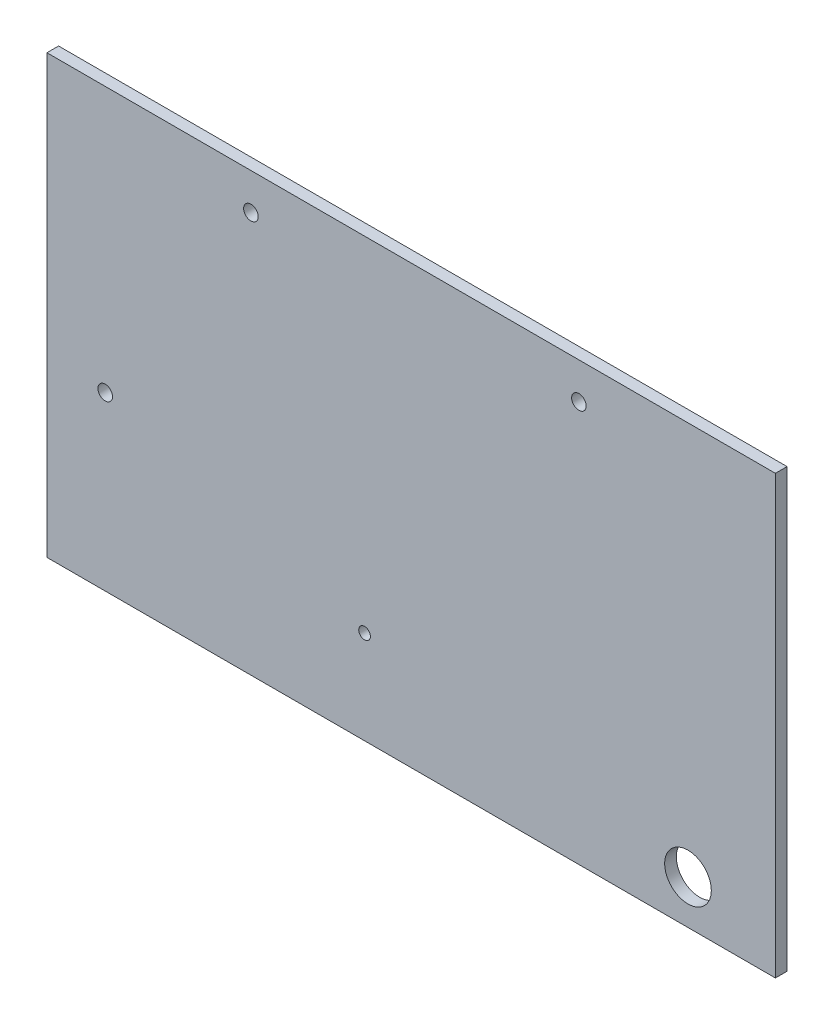
ISO-10303-21;
HEADER;
FILE_DESCRIPTION(('STEP AP214'),'2;1');
FILE_NAME('part.step','',(''),(''),'','','');
FILE_SCHEMA(('AUTOMOTIVE_DESIGN { 1 0 10303 214 1 1 1 1 }'));
ENDSEC;
DATA;
#1=APPLICATION_CONTEXT('core data for automotive mechanical design processes');
#2=APPLICATION_PROTOCOL_DEFINITION('international standard','automotive_design',2000,#1);
#3=PRODUCT_CONTEXT('',#1,'mechanical');
#4=PRODUCT('Part','Part','',(#3));
#5=PRODUCT_RELATED_PRODUCT_CATEGORY('part','',(#4));
#6=PRODUCT_DEFINITION_FORMATION('','',#4);
#7=PRODUCT_DEFINITION_CONTEXT('part definition',#1,'design');
#8=PRODUCT_DEFINITION('design','',#6,#7);
#9=PRODUCT_DEFINITION_SHAPE('','',#8);
#10=(LENGTH_UNIT() NAMED_UNIT(*) SI_UNIT(.MILLI.,.METRE.));
#11=(NAMED_UNIT(*) PLANE_ANGLE_UNIT() SI_UNIT($,.RADIAN.));
#12=(NAMED_UNIT(*) SI_UNIT($,.STERADIAN.) SOLID_ANGLE_UNIT());
#13=UNCERTAINTY_MEASURE_WITH_UNIT(LENGTH_MEASURE(1.E-05),#10,'distance_accuracy_value','');
#14=(GEOMETRIC_REPRESENTATION_CONTEXT(3) GLOBAL_UNCERTAINTY_ASSIGNED_CONTEXT((#13)) GLOBAL_UNIT_ASSIGNED_CONTEXT((#10,
#11,#12)) REPRESENTATION_CONTEXT('',''));
#15=CARTESIAN_POINT('',(0.,0.,0.));
#16=DIRECTION('',(0.,0.,1.));
#17=DIRECTION('',(1.,0.,0.));
#18=AXIS2_PLACEMENT_3D('',#15,#16,#17);
#19=CARTESIAN_POINT('',(-112.824675324675,64.3668831168831,4.));
#20=DIRECTION('',(1.,0.,0.));
#21=DIRECTION('',(0.,1.,0.));
#22=AXIS2_PLACEMENT_3D('',#19,#20,#21);
#23=PLANE('',#22);
#24=DIRECTION('',(0.,-1.,0.));
#25=VECTOR('',#24,1.);
#26=CARTESIAN_POINT('',(-112.824675324675,64.3668831168831,0.));
#27=LINE('',#26,#25);
#28=CARTESIAN_POINT('',(-112.824675324675,64.3668831168831,0.));
#29=VERTEX_POINT('',#28);
#30=CARTESIAN_POINT('',(-112.824675324675,-85.6331168831169,0.));
#31=VERTEX_POINT('',#30);
#32=EDGE_CURVE('E95',#29,#31,#27,.T.);
#33=ORIENTED_EDGE('',*,*,#32,.T.);
#34=DIRECTION('',(0.,0.,-1.));
#35=VECTOR('',#34,1.);
#36=CARTESIAN_POINT('',(-112.824675324675,-85.6331168831169,4.));
#37=LINE('',#36,#35);
#38=CARTESIAN_POINT('',(-112.824675324675,-85.6331168831169,4.));
#39=VERTEX_POINT('',#38);
#40=EDGE_CURVE('E11',#39,#31,#37,.T.);
#41=ORIENTED_EDGE('',*,*,#40,.F.);
#42=DIRECTION('',(0.,-1.,0.));
#43=VECTOR('',#42,1.);
#44=CARTESIAN_POINT('',(-112.824675324675,64.3668831168831,4.));
#45=LINE('',#44,#43);
#46=CARTESIAN_POINT('',(-112.824675324675,64.3668831168831,4.));
#47=VERTEX_POINT('',#46);
#48=EDGE_CURVE('E83',#47,#39,#45,.T.);
#49=ORIENTED_EDGE('',*,*,#48,.F.);
#50=DIRECTION('',(0.,0.,-1.));
#51=VECTOR('',#50,1.);
#52=CARTESIAN_POINT('',(-112.824675324675,64.3668831168831,4.));
#53=LINE('',#52,#51);
#54=EDGE_CURVE('E91',#47,#29,#53,.T.);
#55=ORIENTED_EDGE('',*,*,#54,.T.);
#56=EDGE_LOOP('',(#33,#41,#49,#55));
#57=FACE_BOUND('',#56,.T.);
#58=ADVANCED_FACE('F32',(#57),#23,.F.);
#59=CARTESIAN_POINT('',(-112.824675324675,-85.6331168831169,4.));
#60=DIRECTION('',(0.,1.,0.));
#61=DIRECTION('',(0.,0.,1.));
#62=AXIS2_PLACEMENT_3D('',#59,#60,#61);
#63=PLANE('',#62);
#64=DIRECTION('',(1.,0.,0.));
#65=VECTOR('',#64,1.);
#66=CARTESIAN_POINT('',(-112.824675324675,-85.6331168831169,0.));
#67=LINE('',#66,#65);
#68=CARTESIAN_POINT('',(137.175324675325,-85.6331168831169,0.));
#69=VERTEX_POINT('',#68);
#70=EDGE_CURVE('E87',#31,#69,#67,.T.);
#71=ORIENTED_EDGE('',*,*,#70,.T.);
#72=DIRECTION('',(0.,0.,-1.));
#73=VECTOR('',#72,1.);
#74=CARTESIAN_POINT('',(137.175324675325,-85.6331168831169,4.));
#75=LINE('',#74,#73);
#76=CARTESIAN_POINT('',(137.175324675325,-85.6331168831169,4.));
#77=VERTEX_POINT('',#76);
#78=EDGE_CURVE('E40',#77,#69,#75,.T.);
#79=ORIENTED_EDGE('',*,*,#78,.F.);
#80=DIRECTION('',(1.,0.,0.));
#81=VECTOR('',#80,1.);
#82=CARTESIAN_POINT('',(-112.824675324675,-85.6331168831169,4.));
#83=LINE('',#82,#81);
#84=EDGE_CURVE('E78',#39,#77,#83,.T.);
#85=ORIENTED_EDGE('',*,*,#84,.F.);
#86=ORIENTED_EDGE('',*,*,#40,.T.);
#87=EDGE_LOOP('',(#71,#79,#85,#86));
#88=FACE_BOUND('',#87,.T.);
#89=ADVANCED_FACE('F86',(#88),#63,.F.);
#90=CARTESIAN_POINT('',(137.175324675325,64.3668831168831,4.));
#91=DIRECTION('',(-1.,0.,0.));
#92=DIRECTION('',(0.,0.,1.));
#93=AXIS2_PLACEMENT_3D('',#90,#91,#92);
#94=PLANE('',#93);
#95=DIRECTION('',(0.,1.,0.));
#96=VECTOR('',#95,1.);
#97=CARTESIAN_POINT('',(137.175324675325,64.3668831168831,0.));
#98=LINE('',#97,#96);
#99=CARTESIAN_POINT('',(137.175324675325,64.3668831168831,0.));
#100=VERTEX_POINT('',#99);
#101=EDGE_CURVE('E65',#69,#100,#98,.T.);
#102=ORIENTED_EDGE('',*,*,#101,.T.);
#103=DIRECTION('',(0.,0.,-1.));
#104=VECTOR('',#103,1.);
#105=CARTESIAN_POINT('',(137.175324675325,64.3668831168831,4.));
#106=LINE('',#105,#104);
#107=CARTESIAN_POINT('',(137.175324675325,64.3668831168831,4.));
#108=VERTEX_POINT('',#107);
#109=EDGE_CURVE('E88',#108,#100,#106,.T.);
#110=ORIENTED_EDGE('',*,*,#109,.F.);
#111=DIRECTION('',(0.,1.,0.));
#112=VECTOR('',#111,1.);
#113=CARTESIAN_POINT('',(137.175324675325,64.3668831168831,4.));
#114=LINE('',#113,#112);
#115=EDGE_CURVE('E81',#77,#108,#114,.T.);
#116=ORIENTED_EDGE('',*,*,#115,.F.);
#117=ORIENTED_EDGE('',*,*,#78,.T.);
#118=EDGE_LOOP('',(#102,#110,#116,#117));
#119=FACE_BOUND('',#118,.T.);
#120=ADVANCED_FACE('F89',(#119),#94,.F.);
#121=CARTESIAN_POINT('',(-112.824675324675,64.3668831168831,4.));
#122=DIRECTION('',(0.,-1.,0.));
#123=DIRECTION('',(0.,0.,-1.));
#124=AXIS2_PLACEMENT_3D('',#121,#122,#123);
#125=PLANE('',#124);
#126=DIRECTION('',(-1.,0.,0.));
#127=VECTOR('',#126,1.);
#128=CARTESIAN_POINT('',(-112.824675324675,64.3668831168831,0.));
#129=LINE('',#128,#127);
#130=EDGE_CURVE('E71',#100,#29,#129,.T.);
#131=ORIENTED_EDGE('',*,*,#130,.T.);
#132=ORIENTED_EDGE('',*,*,#54,.F.);
#133=DIRECTION('',(-1.,0.,0.));
#134=VECTOR('',#133,1.);
#135=CARTESIAN_POINT('',(-112.824675324675,64.3668831168831,4.));
#136=LINE('',#135,#134);
#137=EDGE_CURVE('E48',#108,#47,#136,.T.);
#138=ORIENTED_EDGE('',*,*,#137,.F.);
#139=ORIENTED_EDGE('',*,*,#109,.T.);
#140=EDGE_LOOP('',(#131,#132,#138,#139));
#141=FACE_BOUND('',#140,.T.);
#142=ADVANCED_FACE('F103',(#141),#125,.F.);
#143=CARTESIAN_POINT('',(0.,0.,4.));
#144=DIRECTION('',(0.,0.,1.));
#145=DIRECTION('',(1.,0.,0.));
#146=AXIS2_PLACEMENT_3D('',#143,#144,#145);
#147=PLANE('',#146);
#148=CARTESIAN_POINT('',(-3.82467532467539,-53.6331168831169,4.));
#149=DIRECTION('',(0.,0.,-1.));
#150=DIRECTION('',(-1.,0.,0.));
#151=AXIS2_PLACEMENT_3D('',#148,#149,#150);
#152=CIRCLE('',#151,2.);
#153=CARTESIAN_POINT('',(-5.82467532467539,-53.6331168831169,4.));
#154=VERTEX_POINT('',#153);
#155=EDGE_CURVE('E124',#154,#154,#152,.T.);
#156=ORIENTED_EDGE('',*,*,#155,.T.);
#157=EDGE_LOOP('',(#156));
#158=FACE_BOUND('',#157,.T.);
#159=CARTESIAN_POINT('',(69.7391454044957,51.8668831168831,4.));
#160=DIRECTION('',(0.,0.,-1.));
#161=DIRECTION('',(-1.,0.,0.));
#162=AXIS2_PLACEMENT_3D('',#159,#160,#161);
#163=CIRCLE('',#162,2.5);
#164=CARTESIAN_POINT('',(67.2391454044957,51.8668831168831,4.));
#165=VERTEX_POINT('',#164);
#166=EDGE_CURVE('E130',#165,#165,#163,.T.);
#167=ORIENTED_EDGE('',*,*,#166,.T.);
#168=EDGE_LOOP('',(#167));
#169=FACE_BOUND('',#168,.T.);
#170=CARTESIAN_POINT('',(-92.8246753246754,-26.6331168831169,4.));
#171=DIRECTION('',(0.,0.,-1.));
#172=DIRECTION('',(-1.,0.,0.));
#173=AXIS2_PLACEMENT_3D('',#170,#171,#172);
#174=CIRCLE('',#173,2.50000000000001);
#175=CARTESIAN_POINT('',(-95.3246753246754,-26.6331168831169,4.));
#176=VERTEX_POINT('',#175);
#177=EDGE_CURVE('E118',#176,#176,#174,.T.);
#178=ORIENTED_EDGE('',*,*,#177,.T.);
#179=EDGE_LOOP('',(#178));
#180=FACE_BOUND('',#179,.T.);
#181=CARTESIAN_POINT('',(-42.8246753246754,51.8668831168831,4.));
#182=DIRECTION('',(0.,0.,-1.));
#183=DIRECTION('',(-1.,0.,0.));
#184=AXIS2_PLACEMENT_3D('',#181,#182,#183);
#185=CIRCLE('',#184,2.5);
#186=CARTESIAN_POINT('',(-45.3246753246754,51.8668831168831,4.));
#187=VERTEX_POINT('',#186);
#188=EDGE_CURVE('E112',#187,#187,#185,.T.);
#189=ORIENTED_EDGE('',*,*,#188,.T.);
#190=EDGE_LOOP('',(#189));
#191=FACE_BOUND('',#190,.T.);
#192=CARTESIAN_POINT('',(107.175324675325,-70.6331168831169,4.));
#193=DIRECTION('',(0.,0.,1.));
#194=DIRECTION('',(1.,0.,0.));
#195=AXIS2_PLACEMENT_3D('',#192,#193,#194);
#196=CIRCLE('',#195,8.00000000000001);
#197=CARTESIAN_POINT('',(115.175324675325,-70.6331168831169,4.));
#198=VERTEX_POINT('',#197);
#199=EDGE_CURVE('E109',#198,#198,#196,.T.);
#200=ORIENTED_EDGE('',*,*,#199,.F.);
#201=EDGE_LOOP('',(#200));
#202=FACE_BOUND('',#201,.T.);
#203=ORIENTED_EDGE('',*,*,#48,.T.);
#204=ORIENTED_EDGE('',*,*,#84,.T.);
#205=ORIENTED_EDGE('',*,*,#115,.T.);
#206=ORIENTED_EDGE('',*,*,#137,.T.);
#207=EDGE_LOOP('',(#203,#204,#205,#206));
#208=FACE_BOUND('',#207,.T.);
#209=ADVANCED_FACE('F79',(#158,#169,#180,#191,#202,#208),#147,.T.);
#210=CARTESIAN_POINT('',(0.,0.,0.));
#211=DIRECTION('',(0.,0.,1.));
#212=DIRECTION('',(1.,0.,0.));
#213=AXIS2_PLACEMENT_3D('',#210,#211,#212);
#214=PLANE('',#213);
#215=CARTESIAN_POINT('',(-3.82467532467539,-53.6331168831169,0.));
#216=DIRECTION('',(0.,0.,-1.));
#217=DIRECTION('',(-1.,0.,0.));
#218=AXIS2_PLACEMENT_3D('',#215,#216,#217);
#219=CIRCLE('',#218,2.);
#220=CARTESIAN_POINT('',(-5.82467532467539,-53.6331168831169,0.));
#221=VERTEX_POINT('',#220);
#222=EDGE_CURVE('E121',#221,#221,#219,.T.);
#223=ORIENTED_EDGE('',*,*,#222,.F.);
#224=EDGE_LOOP('',(#223));
#225=FACE_BOUND('',#224,.T.);
#226=CARTESIAN_POINT('',(69.7391454044957,51.8668831168831,0.));
#227=DIRECTION('',(0.,0.,-1.));
#228=DIRECTION('',(-1.,0.,0.));
#229=AXIS2_PLACEMENT_3D('',#226,#227,#228);
#230=CIRCLE('',#229,2.5);
#231=CARTESIAN_POINT('',(67.2391454044957,51.8668831168831,0.));
#232=VERTEX_POINT('',#231);
#233=EDGE_CURVE('E127',#232,#232,#230,.T.);
#234=ORIENTED_EDGE('',*,*,#233,.F.);
#235=EDGE_LOOP('',(#234));
#236=FACE_BOUND('',#235,.T.);
#237=CARTESIAN_POINT('',(-92.8246753246754,-26.6331168831169,0.));
#238=DIRECTION('',(0.,0.,-1.));
#239=DIRECTION('',(-1.,0.,0.));
#240=AXIS2_PLACEMENT_3D('',#237,#238,#239);
#241=CIRCLE('',#240,2.50000000000001);
#242=CARTESIAN_POINT('',(-95.3246753246754,-26.6331168831169,0.));
#243=VERTEX_POINT('',#242);
#244=EDGE_CURVE('E133',#243,#243,#241,.T.);
#245=ORIENTED_EDGE('',*,*,#244,.F.);
#246=EDGE_LOOP('',(#245));
#247=FACE_BOUND('',#246,.T.);
#248=CARTESIAN_POINT('',(-42.8246753246754,51.8668831168831,0.));
#249=DIRECTION('',(0.,0.,-1.));
#250=DIRECTION('',(-1.,0.,0.));
#251=AXIS2_PLACEMENT_3D('',#248,#249,#250);
#252=CIRCLE('',#251,2.5);
#253=CARTESIAN_POINT('',(-45.3246753246754,51.8668831168831,0.));
#254=VERTEX_POINT('',#253);
#255=EDGE_CURVE('E115',#254,#254,#252,.T.);
#256=ORIENTED_EDGE('',*,*,#255,.F.);
#257=EDGE_LOOP('',(#256));
#258=FACE_BOUND('',#257,.T.);
#259=CARTESIAN_POINT('',(107.175324675325,-70.6331168831169,0.));
#260=DIRECTION('',(0.,0.,1.));
#261=DIRECTION('',(1.,0.,0.));
#262=AXIS2_PLACEMENT_3D('',#259,#260,#261);
#263=CIRCLE('',#262,8.00000000000001);
#264=CARTESIAN_POINT('',(115.175324675325,-70.6331168831169,0.));
#265=VERTEX_POINT('',#264);
#266=EDGE_CURVE('E98',#265,#265,#263,.T.);
#267=ORIENTED_EDGE('',*,*,#266,.T.);
#268=EDGE_LOOP('',(#267));
#269=FACE_BOUND('',#268,.T.);
#270=ORIENTED_EDGE('',*,*,#32,.F.);
#271=ORIENTED_EDGE('',*,*,#130,.F.);
#272=ORIENTED_EDGE('',*,*,#101,.F.);
#273=ORIENTED_EDGE('',*,*,#70,.F.);
#274=EDGE_LOOP('',(#270,#271,#272,#273));
#275=FACE_BOUND('',#274,.T.);
#276=ADVANCED_FACE('F106',(#225,#236,#247,#258,#269,#275),#214,.F.);
#277=CARTESIAN_POINT('',(107.175324675325,-70.6331168831169,0.));
#278=DIRECTION('',(0.,0.,1.));
#279=DIRECTION('',(1.,0.,0.));
#280=AXIS2_PLACEMENT_3D('',#277,#278,#279);
#281=CYLINDRICAL_SURFACE('',#280,8.00000000000001);
#282=ORIENTED_EDGE('',*,*,#266,.F.);
#283=EDGE_LOOP('',(#282));
#284=FACE_BOUND('',#283,.T.);
#285=ORIENTED_EDGE('',*,*,#199,.T.);
#286=EDGE_LOOP('',(#285));
#287=FACE_BOUND('',#286,.T.);
#288=ADVANCED_FACE('F151',(#284,#287),#281,.F.);
#289=CARTESIAN_POINT('',(-42.8246753246754,51.8668831168831,4.));
#290=DIRECTION('',(0.,0.,-1.));
#291=DIRECTION('',(-1.,0.,0.));
#292=AXIS2_PLACEMENT_3D('',#289,#290,#291);
#293=CYLINDRICAL_SURFACE('',#292,2.5);
#294=ORIENTED_EDGE('',*,*,#188,.F.);
#295=EDGE_LOOP('',(#294));
#296=FACE_BOUND('',#295,.T.);
#297=ORIENTED_EDGE('',*,*,#255,.T.);
#298=EDGE_LOOP('',(#297));
#299=FACE_BOUND('',#298,.T.);
#300=ADVANCED_FACE('F145',(#296,#299),#293,.F.);
#301=CARTESIAN_POINT('',(-92.8246753246754,-26.6331168831169,4.));
#302=DIRECTION('',(0.,0.,-1.));
#303=DIRECTION('',(-1.,0.,0.));
#304=AXIS2_PLACEMENT_3D('',#301,#302,#303);
#305=CYLINDRICAL_SURFACE('',#304,2.50000000000001);
#306=ORIENTED_EDGE('',*,*,#177,.F.);
#307=EDGE_LOOP('',(#306));
#308=FACE_BOUND('',#307,.T.);
#309=ORIENTED_EDGE('',*,*,#244,.T.);
#310=EDGE_LOOP('',(#309));
#311=FACE_BOUND('',#310,.T.);
#312=ADVANCED_FACE('F141',(#308,#311),#305,.F.);
#313=CARTESIAN_POINT('',(69.7391454044957,51.8668831168831,4.));
#314=DIRECTION('',(0.,0.,-1.));
#315=DIRECTION('',(-1.,0.,0.));
#316=AXIS2_PLACEMENT_3D('',#313,#314,#315);
#317=CYLINDRICAL_SURFACE('',#316,2.5);
#318=ORIENTED_EDGE('',*,*,#166,.F.);
#319=EDGE_LOOP('',(#318));
#320=FACE_BOUND('',#319,.T.);
#321=ORIENTED_EDGE('',*,*,#233,.T.);
#322=EDGE_LOOP('',(#321));
#323=FACE_BOUND('',#322,.T.);
#324=ADVANCED_FACE('F144',(#320,#323),#317,.F.);
#325=CARTESIAN_POINT('',(-3.82467532467539,-53.6331168831169,4.));
#326=DIRECTION('',(0.,0.,-1.));
#327=DIRECTION('',(-1.,0.,0.));
#328=AXIS2_PLACEMENT_3D('',#325,#326,#327);
#329=CYLINDRICAL_SURFACE('',#328,2.);
#330=ORIENTED_EDGE('',*,*,#155,.F.);
#331=EDGE_LOOP('',(#330));
#332=FACE_BOUND('',#331,.T.);
#333=ORIENTED_EDGE('',*,*,#222,.T.);
#334=EDGE_LOOP('',(#333));
#335=FACE_BOUND('',#334,.T.);
#336=ADVANCED_FACE('F225',(#332,#335),#329,.F.);
#337=CLOSED_SHELL('',(#58,#89,#120,#142,#209,#276,#288,#300,#312,#324,#336));
#338=MANIFOLD_SOLID_BREP('B2',#337);
#339=ADVANCED_BREP_SHAPE_REPRESENTATION('',(#18,#338),#14);
#340=SHAPE_DEFINITION_REPRESENTATION(#9,#339);
ENDSEC;
END-ISO-10303-21;
